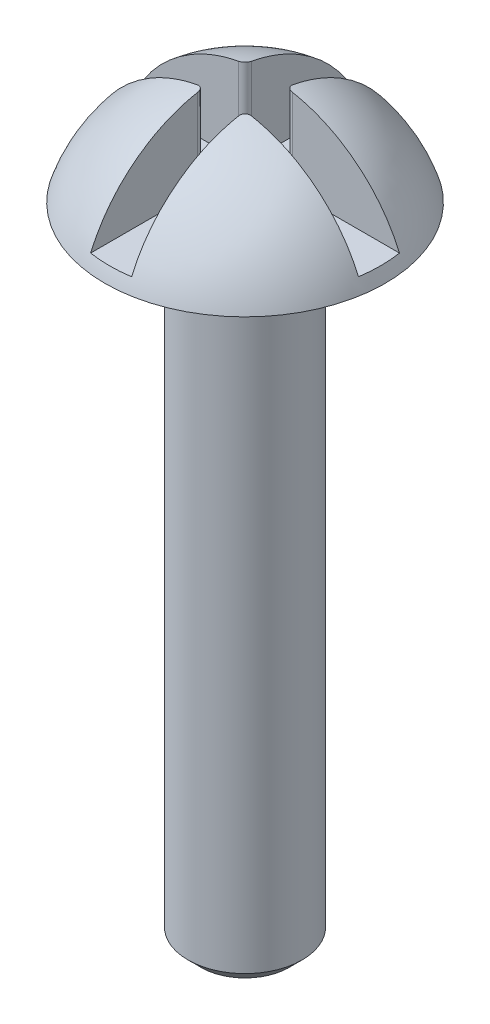
ISO-10303-21;
HEADER;
FILE_DESCRIPTION(('STEP AP214'),'2;1');
FILE_NAME('part.step','',(''),(''),'','','');
FILE_SCHEMA(('AUTOMOTIVE_DESIGN { 1 0 10303 214 1 1 1 1 }'));
ENDSEC;
DATA;
#1=APPLICATION_CONTEXT('core data for automotive mechanical design processes');
#2=APPLICATION_PROTOCOL_DEFINITION('international standard','automotive_design',2000,#1);
#3=PRODUCT_CONTEXT('',#1,'mechanical');
#4=PRODUCT('Part','Part','',(#3));
#5=PRODUCT_RELATED_PRODUCT_CATEGORY('part','',(#4));
#6=PRODUCT_DEFINITION_FORMATION('','',#4);
#7=PRODUCT_DEFINITION_CONTEXT('part definition',#1,'design');
#8=PRODUCT_DEFINITION('design','',#6,#7);
#9=PRODUCT_DEFINITION_SHAPE('','',#8);
#10=(LENGTH_UNIT() NAMED_UNIT(*) SI_UNIT(.MILLI.,.METRE.));
#11=(NAMED_UNIT(*) PLANE_ANGLE_UNIT() SI_UNIT($,.RADIAN.));
#12=(NAMED_UNIT(*) SI_UNIT($,.STERADIAN.) SOLID_ANGLE_UNIT());
#13=UNCERTAINTY_MEASURE_WITH_UNIT(LENGTH_MEASURE(1.E-05),#10,'distance_accuracy_value','');
#14=(GEOMETRIC_REPRESENTATION_CONTEXT(3) GLOBAL_UNCERTAINTY_ASSIGNED_CONTEXT((#13)) GLOBAL_UNIT_ASSIGNED_CONTEXT((#10,
#11,#12)) REPRESENTATION_CONTEXT('',''));
#15=CARTESIAN_POINT('',(0.,0.,0.));
#16=DIRECTION('',(0.,0.,1.));
#17=DIRECTION('',(1.,0.,0.));
#18=AXIS2_PLACEMENT_3D('',#15,#16,#17);
#19=CARTESIAN_POINT('',(0.,-0.8874521875,0.));
#20=DIRECTION('',(0.,1.,0.));
#21=DIRECTION('',(0.,0.,-1.));
#22=AXIS2_PLACEMENT_3D('',#19,#20,#21);
#23=SPHERICAL_SURFACE('',#22,2.9194521875);
#24=CARTESIAN_POINT('',(0.,0.,0.));
#25=DIRECTION('',(0.,1.,0.));
#26=DIRECTION('',(0.,0.,1.));
#27=AXIS2_PLACEMENT_3D('',#24,#25,#26);
#28=CIRCLE('',#27,2.7813);
#29=CARTESIAN_POINT('',(0.,0.,2.7813));
#30=VERTEX_POINT('',#29);
#31=EDGE_CURVE('E141',#30,#30,#28,.T.);
#32=ORIENTED_EDGE('',*,*,#31,.T.);
#33=EDGE_LOOP('',(#32));
#34=FACE_BOUND('',#33,.T.);
#35=CARTESIAN_POINT('',(0.,-0.8874521875,0.4064));
#36=DIRECTION('',(0.,0.,-1.));
#37=DIRECTION('',(-1.,0.,0.));
#38=AXIS2_PLACEMENT_3D('',#35,#36,#37);
#39=CIRCLE('',#38,2.89102751891063);
#40=CARTESIAN_POINT('',(0.5334,1.95394263812676,0.4064));
#41=VERTEX_POINT('',#40);
#42=CARTESIAN_POINT('',(2.65614890748806,0.254,0.4064));
#43=VERTEX_POINT('',#42);
#44=EDGE_CURVE('E130',#41,#43,#39,.T.);
#45=ORIENTED_EDGE('',*,*,#44,.F.);
#46=CARTESIAN_POINT('',(0.5334,1.95394263812676,0.4064));
#47=CARTESIAN_POINT('',(0.526429818175139,1.95525229722327,0.406393656141367));
#48=CARTESIAN_POINT('',(0.519437835446964,1.95645509605652,0.406973594128656));
#49=CARTESIAN_POINT('',(0.505606235655716,1.95861553609979,0.4092821138562));
#50=CARTESIAN_POINT('',(0.498766646008504,1.95957313351748,0.411010900579816));
#51=CARTESIAN_POINT('',(0.485430256638656,1.96121224794666,0.41559599247346));
#52=CARTESIAN_POINT('',(0.478933887553856,1.96189342496913,0.418453677685523));
#53=CARTESIAN_POINT('',(0.466492205552098,1.96295524916309,0.425222198161783));
#54=CARTESIAN_POINT('',(0.460546593915372,1.96333606009944,0.429132457981764));
#55=CARTESIAN_POINT('',(0.449486927445761,1.96378044826487,0.437816878775803));
#56=CARTESIAN_POINT('',(0.444359620352882,1.96384971613864,0.442573878351436));
#57=CARTESIAN_POINT('',(0.434956144691681,1.96368421809729,0.45286200159492));
#58=CARTESIAN_POINT('',(0.430680051299517,1.96344942534235,0.458393193563276));
#59=CARTESIAN_POINT('',(0.423132521628344,1.96268707574739,0.470014757316168));
#60=CARTESIAN_POINT('',(0.419852633333455,1.96216209494732,0.47609982079818));
#61=CARTESIAN_POINT('',(0.414329348110143,1.9608378635328,0.488695976120198));
#62=CARTESIAN_POINT('',(0.412085879160701,1.96003863198283,0.495207038321548));
#63=CARTESIAN_POINT('',(0.409056788031691,1.95839420105987,0.507011870443117));
#64=CARTESIAN_POINT('',(0.4080593321899,1.95759753777458,0.51225938370448));
#65=CARTESIAN_POINT('',(0.406730640863846,1.95586838945596,0.522808202103091));
#66=CARTESIAN_POINT('',(0.406398441009912,1.9549361031323,0.528109418162684));
#67=CARTESIAN_POINT('',(0.406399999999747,1.95394263812875,0.533400000000212));
#68=B_SPLINE_CURVE_WITH_KNOTS('',3,(#46,#47,#48,#49,#50,#51,#52,#53,#54,#55,#56,#57,#58,#59,#60,
#61,#62,#63,#64,#65,#66,#67),.UNSPECIFIED.,.F.,.F.,(4,2,2,2,2,2,2,2,2,2,4),(0.,
0.0212545383082465,0.0425128699765531,0.0637972700923001,0.0850700575426839,0.105952655327571,
0.126837096571577,0.147539053766297,0.168239572160783,0.184399511119075,0.200536007268686),.UNSPECIFIED.);
#69=CARTESIAN_POINT('',(0.4064,1.95394263812676,0.533399999999999));
#70=VERTEX_POINT('',#69);
#71=EDGE_CURVE('E199',#41,#70,#68,.T.);
#72=ORIENTED_EDGE('',*,*,#71,.T.);
#73=CARTESIAN_POINT('',(0.4064,-0.8874521875,0.));
#74=DIRECTION('',(-1.,0.,0.));
#75=DIRECTION('',(0.,0.,1.));
#76=AXIS2_PLACEMENT_3D('',#73,#74,#75);
#77=CIRCLE('',#76,2.89102751891063);
#78=CARTESIAN_POINT('',(0.4064,0.254,2.65614890748806));
#79=VERTEX_POINT('',#78);
#80=EDGE_CURVE('E157',#79,#70,#77,.T.);
#81=ORIENTED_EDGE('',*,*,#80,.F.);
#82=CARTESIAN_POINT('',(0.,0.254,0.));
#83=DIRECTION('',(0.,-1.,0.));
#84=DIRECTION('',(0.,0.,-1.));
#85=AXIS2_PLACEMENT_3D('',#82,#83,#84);
#86=CIRCLE('',#85,2.68705935527111);
#87=CARTESIAN_POINT('',(-0.4064,0.254,2.65614890748806));
#88=VERTEX_POINT('',#87);
#89=EDGE_CURVE('E133',#79,#88,#86,.T.);
#90=ORIENTED_EDGE('',*,*,#89,.T.);
#91=CARTESIAN_POINT('',(-0.4064,-0.8874521875,0.));
#92=DIRECTION('',(1.,0.,0.));
#93=DIRECTION('',(0.,0.,-1.));
#94=AXIS2_PLACEMENT_3D('',#91,#92,#93);
#95=CIRCLE('',#94,2.89102751891063);
#96=CARTESIAN_POINT('',(-0.4064,1.95394263812676,0.5334));
#97=VERTEX_POINT('',#96);
#98=EDGE_CURVE('E163',#97,#88,#95,.T.);
#99=ORIENTED_EDGE('',*,*,#98,.F.);
#100=CARTESIAN_POINT('',(-0.4064,1.95394263812676,0.5334));
#101=CARTESIAN_POINT('',(-0.406393656141367,1.95525229722327,0.526429818175139));
#102=CARTESIAN_POINT('',(-0.406973594128656,1.95645509605652,0.519437835446964));
#103=CARTESIAN_POINT('',(-0.4092821138562,1.95861553609979,0.505606235655716));
#104=CARTESIAN_POINT('',(-0.411010900579817,1.95957313351748,0.498766646008504));
#105=CARTESIAN_POINT('',(-0.41559599247346,1.96121224794666,0.485430256638656));
#106=CARTESIAN_POINT('',(-0.418453677685524,1.96189342496913,0.478933887553856));
#107=CARTESIAN_POINT('',(-0.425222198161783,1.96295524916309,0.466492205552098));
#108=CARTESIAN_POINT('',(-0.429132457981765,1.96333606009944,0.460546593915372));
#109=CARTESIAN_POINT('',(-0.437816878775803,1.96378044826487,0.449486927445761));
#110=CARTESIAN_POINT('',(-0.442573878351437,1.96384971613864,0.444359620352882));
#111=CARTESIAN_POINT('',(-0.452862001594921,1.96368421809729,0.434956144691681));
#112=CARTESIAN_POINT('',(-0.458393193563277,1.96344942534234,0.430680051299517));
#113=CARTESIAN_POINT('',(-0.470014757316169,1.96268707574739,0.423132521628344));
#114=CARTESIAN_POINT('',(-0.47609982079818,1.96216209494732,0.419852633333455));
#115=CARTESIAN_POINT('',(-0.488695976120198,1.9608378635328,0.414329348110143));
#116=CARTESIAN_POINT('',(-0.495207038321549,1.96003863198283,0.4120858791607));
#117=CARTESIAN_POINT('',(-0.507011870443117,1.95839420105987,0.409056788031691));
#118=CARTESIAN_POINT('',(-0.51225938370448,1.95759753777458,0.4080593321899));
#119=CARTESIAN_POINT('',(-0.522808202103091,1.95586838945596,0.406730640863846));
#120=CARTESIAN_POINT('',(-0.528109418162684,1.9549361031323,0.406398441009912));
#121=CARTESIAN_POINT('',(-0.533400000000212,1.95394263812875,0.406399999999747));
#122=B_SPLINE_CURVE_WITH_KNOTS('',3,(#100,#101,#102,#103,#104,#105,#106,#107,#108,#109,#110,
#111,#112,#113,#114,#115,#116,#117,#118,#119,#120,#121),.UNSPECIFIED.,.F.,.F.,(4,2,2,2,2,2,2,2,
2,2,4),(0.,0.0212545383082466,0.0425128699765532,0.0637972700923003,0.0850700575426841,
0.105952655327572,0.126837096571577,0.147539053766297,0.168239572160783,0.184399511119075,
0.200536007268686),.UNSPECIFIED.);
#123=CARTESIAN_POINT('',(-0.5334,1.95394263812676,0.4064));
#124=VERTEX_POINT('',#123);
#125=EDGE_CURVE('E177',#97,#124,#122,.T.);
#126=ORIENTED_EDGE('',*,*,#125,.T.);
#127=CARTESIAN_POINT('',(0.,-0.8874521875,0.4064));
#128=DIRECTION('',(0.,0.,-1.));
#129=DIRECTION('',(-1.,0.,0.));
#130=AXIS2_PLACEMENT_3D('',#127,#128,#129);
#131=CIRCLE('',#130,2.89102751891063);
#132=CARTESIAN_POINT('',(-2.65614890748806,0.254,0.4064));
#133=VERTEX_POINT('',#132);
#134=EDGE_CURVE('E160',#133,#124,#131,.T.);
#135=ORIENTED_EDGE('',*,*,#134,.F.);
#136=CARTESIAN_POINT('',(-2.65614890748806,0.254,-0.4064));
#137=VERTEX_POINT('',#136);
#138=EDGE_CURVE('E131',#133,#137,#86,.T.);
#139=ORIENTED_EDGE('',*,*,#138,.T.);
#140=CARTESIAN_POINT('',(0.,-0.8874521875,-0.406399999999999));
#141=DIRECTION('',(0.,0.,1.));
#142=DIRECTION('',(1.,0.,0.));
#143=AXIS2_PLACEMENT_3D('',#140,#141,#142);
#144=CIRCLE('',#143,2.89102751891063);
#145=CARTESIAN_POINT('',(-0.5334,1.95394263812676,-0.406399999999999));
#146=VERTEX_POINT('',#145);
#147=EDGE_CURVE('E146',#146,#137,#144,.T.);
#148=ORIENTED_EDGE('',*,*,#147,.F.);
#149=CARTESIAN_POINT('',(-0.5334,1.95394263812676,-0.406399999999999));
#150=CARTESIAN_POINT('',(-0.526429818175138,1.95525229722327,-0.406393656141367));
#151=CARTESIAN_POINT('',(-0.519437835446964,1.95645509605652,-0.406973594128656));
#152=CARTESIAN_POINT('',(-0.505606235655716,1.95861553609979,-0.4092821138562));
#153=CARTESIAN_POINT('',(-0.498766646008504,1.95957313351748,-0.411010900579816));
#154=CARTESIAN_POINT('',(-0.485430256638656,1.96121224794666,-0.41559599247346));
#155=CARTESIAN_POINT('',(-0.478933887553856,1.96189342496913,-0.418453677685523));
#156=CARTESIAN_POINT('',(-0.466492205552098,1.96295524916309,-0.425222198161783));
#157=CARTESIAN_POINT('',(-0.460546593915372,1.96333606009944,-0.429132457981764));
#158=CARTESIAN_POINT('',(-0.449486927445761,1.96378044826487,-0.437816878775803));
#159=CARTESIAN_POINT('',(-0.444359620352882,1.96384971613864,-0.442573878351436));
#160=CARTESIAN_POINT('',(-0.434956144691681,1.96368421809729,-0.45286200159492));
#161=CARTESIAN_POINT('',(-0.430680051299517,1.96344942534235,-0.458393193563276));
#162=CARTESIAN_POINT('',(-0.423132521628344,1.96268707574739,-0.470014757316168));
#163=CARTESIAN_POINT('',(-0.419852633333455,1.96216209494732,-0.47609982079818));
#164=CARTESIAN_POINT('',(-0.414329348110143,1.9608378635328,-0.488695976120198));
#165=CARTESIAN_POINT('',(-0.412085879160701,1.96003863198283,-0.495207038321548));
#166=CARTESIAN_POINT('',(-0.409056788031691,1.95839420105987,-0.507011870443117));
#167=CARTESIAN_POINT('',(-0.4080593321899,1.95759753777458,-0.51225938370448));
#168=CARTESIAN_POINT('',(-0.406730640863846,1.95586838945596,-0.522808202103091));
#169=CARTESIAN_POINT('',(-0.406398441009912,1.9549361031323,-0.528109418162684));
#170=CARTESIAN_POINT('',(-0.406399999999747,1.95394263812875,-0.533400000000212));
#171=B_SPLINE_CURVE_WITH_KNOTS('',3,(#149,#150,#151,#152,#153,#154,#155,#156,#157,#158,#159,
#160,#161,#162,#163,#164,#165,#166,#167,#168,#169,#170),.UNSPECIFIED.,.F.,.F.,(4,2,2,2,2,2,2,2,
2,2,4),(0.,0.0212545383082464,0.0425128699765531,0.0637972700923001,0.0850700575426839,
0.105952655327571,0.126837096571576,0.147539053766297,0.168239572160783,0.184399511119075,
0.200536007268686),.UNSPECIFIED.);
#172=CARTESIAN_POINT('',(-0.4064,1.95394263812676,-0.533399999999999));
#173=VERTEX_POINT('',#172);
#174=EDGE_CURVE('E171',#146,#173,#171,.T.);
#175=ORIENTED_EDGE('',*,*,#174,.T.);
#176=CARTESIAN_POINT('',(-0.4064,-0.8874521875,0.));
#177=DIRECTION('',(1.,0.,0.));
#178=DIRECTION('',(0.,0.,-1.));
#179=AXIS2_PLACEMENT_3D('',#176,#177,#178);
#180=CIRCLE('',#179,2.89102751891063);
#181=CARTESIAN_POINT('',(-0.4064,0.254,-2.65614890748806));
#182=VERTEX_POINT('',#181);
#183=EDGE_CURVE('E152',#182,#173,#180,.T.);
#184=ORIENTED_EDGE('',*,*,#183,.F.);
#185=CARTESIAN_POINT('',(0.4064,0.254,-2.65614890748806));
#186=VERTEX_POINT('',#185);
#187=EDGE_CURVE('E255',#182,#186,#86,.T.);
#188=ORIENTED_EDGE('',*,*,#187,.T.);
#189=CARTESIAN_POINT('',(0.4064,-0.8874521875,0.));
#190=DIRECTION('',(-1.,0.,0.));
#191=DIRECTION('',(0.,0.,1.));
#192=AXIS2_PLACEMENT_3D('',#189,#190,#191);
#193=CIRCLE('',#192,2.89102751891063);
#194=CARTESIAN_POINT('',(0.4064,1.95394263812676,-0.5334));
#195=VERTEX_POINT('',#194);
#196=EDGE_CURVE('E147',#195,#186,#193,.T.);
#197=ORIENTED_EDGE('',*,*,#196,.F.);
#198=CARTESIAN_POINT('',(0.4064,1.95394263812676,-0.5334));
#199=CARTESIAN_POINT('',(0.406393656141368,1.95525229722327,-0.526429818175138));
#200=CARTESIAN_POINT('',(0.406973594128657,1.95645509605652,-0.519437835446964));
#201=CARTESIAN_POINT('',(0.409282113856201,1.95861553609979,-0.505606235655716));
#202=CARTESIAN_POINT('',(0.411010900579817,1.95957313351748,-0.498766646008504));
#203=CARTESIAN_POINT('',(0.41559599247346,1.96121224794666,-0.485430256638656));
#204=CARTESIAN_POINT('',(0.418453677685524,1.96189342496913,-0.478933887553856));
#205=CARTESIAN_POINT('',(0.425222198161783,1.96295524916309,-0.466492205552098));
#206=CARTESIAN_POINT('',(0.429132457981765,1.96333606009944,-0.460546593915372));
#207=CARTESIAN_POINT('',(0.437816878775804,1.96378044826487,-0.449486927445761));
#208=CARTESIAN_POINT('',(0.442573878351437,1.96384971613864,-0.444359620352882));
#209=CARTESIAN_POINT('',(0.452862001594921,1.96368421809729,-0.434956144691681));
#210=CARTESIAN_POINT('',(0.458393193563277,1.96344942534234,-0.430680051299517));
#211=CARTESIAN_POINT('',(0.470014757316169,1.96268707574739,-0.423132521628343));
#212=CARTESIAN_POINT('',(0.47609982079818,1.96216209494732,-0.419852633333455));
#213=CARTESIAN_POINT('',(0.488695976120199,1.9608378635328,-0.414329348110143));
#214=CARTESIAN_POINT('',(0.495207038321549,1.96003863198283,-0.4120858791607));
#215=CARTESIAN_POINT('',(0.507011870443118,1.95839420105987,-0.409056788031691));
#216=CARTESIAN_POINT('',(0.512259383704481,1.95759753777458,-0.4080593321899));
#217=CARTESIAN_POINT('',(0.522808202103091,1.95586838945596,-0.406730640863846));
#218=CARTESIAN_POINT('',(0.528109418162684,1.9549361031323,-0.406398441009912));
#219=CARTESIAN_POINT('',(0.533400000000213,1.95394263812875,-0.406399999999747));
#220=B_SPLINE_CURVE_WITH_KNOTS('',3,(#198,#199,#200,#201,#202,#203,#204,#205,#206,#207,#208,
#209,#210,#211,#212,#213,#214,#215,#216,#217,#218,#219),.UNSPECIFIED.,.F.,.F.,(4,2,2,2,2,2,2,2,
2,2,4),(0.,0.0212545383082464,0.0425128699765531,0.0637972700923001,0.085070057542684,
0.105952655327572,0.126837096571577,0.147539053766297,0.168239572160783,0.184399511119075,
0.200536007268686),.UNSPECIFIED.);
#221=CARTESIAN_POINT('',(0.5334,1.95394263812676,-0.4064));
#222=VERTEX_POINT('',#221);
#223=EDGE_CURVE('E145',#195,#222,#220,.T.);
#224=ORIENTED_EDGE('',*,*,#223,.T.);
#225=CARTESIAN_POINT('',(0.,-0.8874521875,-0.4064));
#226=DIRECTION('',(0.,0.,1.));
#227=DIRECTION('',(1.,0.,0.));
#228=AXIS2_PLACEMENT_3D('',#225,#226,#227);
#229=CIRCLE('',#228,2.89102751891063);
#230=CARTESIAN_POINT('',(2.65614890748806,0.254,-0.4064));
#231=VERTEX_POINT('',#230);
#232=EDGE_CURVE('E138',#231,#222,#229,.T.);
#233=ORIENTED_EDGE('',*,*,#232,.F.);
#234=EDGE_CURVE('E120',#231,#43,#86,.T.);
#235=ORIENTED_EDGE('',*,*,#234,.T.);
#236=EDGE_LOOP('',(#45,#72,#81,#90,#99,#126,#135,#139,#148,#175,#184,#188,#197,#224,#233,#235));
#237=FACE_BOUND('',#236,.T.);
#238=ADVANCED_FACE('F33',(#34,#237),#23,.T.);
#239=CARTESIAN_POINT('',(0.,0.,0.));
#240=DIRECTION('',(0.,1.,0.));
#241=DIRECTION('',(0.,0.,1.));
#242=AXIS2_PLACEMENT_3D('',#239,#240,#241);
#243=PLANE('',#242);
#244=ORIENTED_EDGE('',*,*,#31,.F.);
#245=EDGE_LOOP('',(#244));
#246=FACE_BOUND('',#245,.T.);
#247=CARTESIAN_POINT('',(0.,0.,0.));
#248=DIRECTION('',(0.,1.,0.));
#249=DIRECTION('',(0.,0.,1.));
#250=AXIS2_PLACEMENT_3D('',#247,#248,#249);
#251=CIRCLE('',#250,1.1303);
#252=CARTESIAN_POINT('',(0.,0.,1.1303));
#253=VERTEX_POINT('',#252);
#254=EDGE_CURVE('E247',#253,#253,#251,.F.);
#255=ORIENTED_EDGE('',*,*,#254,.F.);
#256=EDGE_LOOP('',(#255));
#257=FACE_BOUND('',#256,.T.);
#258=ADVANCED_FACE('F186',(#246,#257),#243,.F.);
#259=CARTESIAN_POINT('',(0.,-12.7,0.));
#260=DIRECTION('',(0.,1.,0.));
#261=DIRECTION('',(0.,0.,1.));
#262=AXIS2_PLACEMENT_3D('',#259,#260,#261);
#263=CYLINDRICAL_SURFACE('',#262,1.1303);
#264=CARTESIAN_POINT('',(0.,-12.446,0.));
#265=DIRECTION('',(0.,-1.,0.));
#266=DIRECTION('',(0.,0.,-1.));
#267=AXIS2_PLACEMENT_3D('',#264,#265,#266);
#268=CIRCLE('',#267,1.1303);
#269=CARTESIAN_POINT('',(0.,-12.446,-1.1303));
#270=VERTEX_POINT('',#269);
#271=EDGE_CURVE('E253',#270,#270,#268,.F.);
#272=ORIENTED_EDGE('',*,*,#271,.T.);
#273=EDGE_LOOP('',(#272));
#274=FACE_BOUND('',#273,.T.);
#275=ORIENTED_EDGE('',*,*,#254,.T.);
#276=EDGE_LOOP('',(#275));
#277=FACE_BOUND('',#276,.T.);
#278=ADVANCED_FACE('F188',(#274,#277),#263,.T.);
#279=CARTESIAN_POINT('',(0.,-12.7,0.));
#280=DIRECTION('',(0.,-1.,0.));
#281=DIRECTION('',(0.,0.,-1.));
#282=AXIS2_PLACEMENT_3D('',#279,#280,#281);
#283=PLANE('',#282);
#284=CARTESIAN_POINT('',(0.,-12.7,0.));
#285=DIRECTION('',(0.,-1.,0.));
#286=DIRECTION('',(0.,0.,-1.));
#287=AXIS2_PLACEMENT_3D('',#284,#285,#286);
#288=CIRCLE('',#287,0.8763);
#289=CARTESIAN_POINT('',(0.,-12.7,-0.876300000000002));
#290=VERTEX_POINT('',#289);
#291=EDGE_CURVE('E250',#290,#290,#288,.T.);
#292=ORIENTED_EDGE('',*,*,#291,.T.);
#293=EDGE_LOOP('',(#292));
#294=FACE_BOUND('',#293,.T.);
#295=ADVANCED_FACE('F303',(#294),#283,.T.);
#296=CARTESIAN_POINT('',(0.,-12.7,0.));
#297=DIRECTION('',(0.,1.,0.));
#298=DIRECTION('',(0.,0.,1.));
#299=AXIS2_PLACEMENT_3D('',#296,#297,#298);
#300=CONICAL_SURFACE('',#299,0.8763,0.785398163397444);
#301=ORIENTED_EDGE('',*,*,#271,.F.);
#302=EDGE_LOOP('',(#301));
#303=FACE_BOUND('',#302,.T.);
#304=ORIENTED_EDGE('',*,*,#291,.F.);
#305=EDGE_LOOP('',(#304));
#306=FACE_BOUND('',#305,.T.);
#307=ADVANCED_FACE('F295',(#303,#306),#300,.T.);
#308=CARTESIAN_POINT('',(0.4064,2.032,-0.4064));
#309=DIRECTION('',(-1.,0.,0.));
#310=DIRECTION('',(0.,0.,1.));
#311=AXIS2_PLACEMENT_3D('',#308,#309,#310);
#312=PLANE('',#311);
#313=DIRECTION('',(0.,0.,-1.));
#314=VECTOR('',#313,1.);
#315=CARTESIAN_POINT('',(0.4064,0.254,-0.4064));
#316=LINE('',#315,#314);
#317=CARTESIAN_POINT('',(0.4064,0.254,-0.5334));
#318=VERTEX_POINT('',#317);
#319=EDGE_CURVE('E292',#318,#186,#316,.T.);
#320=ORIENTED_EDGE('',*,*,#319,.F.);
#321=DIRECTION('',(0.,-1.,0.));
#322=VECTOR('',#321,1.);
#323=CARTESIAN_POINT('',(0.4064,2.032,-0.5334));
#324=LINE('',#323,#322);
#325=EDGE_CURVE('E286',#318,#195,#324,.F.);
#326=ORIENTED_EDGE('',*,*,#325,.T.);
#327=ORIENTED_EDGE('',*,*,#196,.T.);
#328=EDGE_LOOP('',(#320,#326,#327));
#329=FACE_BOUND('',#328,.T.);
#330=ADVANCED_FACE('F291',(#329),#312,.T.);
#331=CARTESIAN_POINT('',(-0.4064,2.032,-0.406399999999999));
#332=DIRECTION('',(1.,0.,0.));
#333=DIRECTION('',(0.,0.,-1.));
#334=AXIS2_PLACEMENT_3D('',#331,#332,#333);
#335=PLANE('',#334);
#336=ORIENTED_EDGE('',*,*,#183,.T.);
#337=DIRECTION('',(0.,-1.,0.));
#338=VECTOR('',#337,1.);
#339=CARTESIAN_POINT('',(-0.4064,2.032,-0.533399999999999));
#340=LINE('',#339,#338);
#341=CARTESIAN_POINT('',(-0.4064,0.254,-0.533399999999999));
#342=VERTEX_POINT('',#341);
#343=EDGE_CURVE('E262',#173,#342,#340,.T.);
#344=ORIENTED_EDGE('',*,*,#343,.T.);
#345=DIRECTION('',(0.,0.,1.));
#346=VECTOR('',#345,1.);
#347=CARTESIAN_POINT('',(-0.4064,0.254,-0.406399999999999));
#348=LINE('',#347,#346);
#349=EDGE_CURVE('E238',#182,#342,#348,.T.);
#350=ORIENTED_EDGE('',*,*,#349,.F.);
#351=EDGE_LOOP('',(#336,#344,#350));
#352=FACE_BOUND('',#351,.T.);
#353=ADVANCED_FACE('F261',(#352),#335,.T.);
#354=CARTESIAN_POINT('',(-0.4064,2.032,-0.406399999999999));
#355=DIRECTION('',(0.,0.,1.));
#356=DIRECTION('',(1.,0.,0.));
#357=AXIS2_PLACEMENT_3D('',#354,#355,#356);
#358=PLANE('',#357);
#359=DIRECTION('',(-1.,0.,0.));
#360=VECTOR('',#359,1.);
#361=CARTESIAN_POINT('',(-0.4064,0.254,-0.406399999999999));
#362=LINE('',#361,#360);
#363=CARTESIAN_POINT('',(-0.5334,0.254,-0.406399999999999));
#364=VERTEX_POINT('',#363);
#365=EDGE_CURVE('E234',#364,#137,#362,.T.);
#366=ORIENTED_EDGE('',*,*,#365,.F.);
#367=DIRECTION('',(0.,-1.,0.));
#368=VECTOR('',#367,1.);
#369=CARTESIAN_POINT('',(-0.5334,2.032,-0.406399999999999));
#370=LINE('',#369,#368);
#371=EDGE_CURVE('E264',#364,#146,#370,.F.);
#372=ORIENTED_EDGE('',*,*,#371,.T.);
#373=ORIENTED_EDGE('',*,*,#147,.T.);
#374=EDGE_LOOP('',(#366,#372,#373));
#375=FACE_BOUND('',#374,.T.);
#376=ADVANCED_FACE('F301',(#375),#358,.T.);
#377=CARTESIAN_POINT('',(-0.4064,2.032,0.4064));
#378=DIRECTION('',(0.,0.,-1.));
#379=DIRECTION('',(-1.,0.,0.));
#380=AXIS2_PLACEMENT_3D('',#377,#378,#379);
#381=PLANE('',#380);
#382=ORIENTED_EDGE('',*,*,#134,.T.);
#383=DIRECTION('',(0.,-1.,0.));
#384=VECTOR('',#383,1.);
#385=CARTESIAN_POINT('',(-0.5334,2.032,0.4064));
#386=LINE('',#385,#384);
#387=CARTESIAN_POINT('',(-0.5334,0.254,0.4064));
#388=VERTEX_POINT('',#387);
#389=EDGE_CURVE('E223',#124,#388,#386,.T.);
#390=ORIENTED_EDGE('',*,*,#389,.T.);
#391=DIRECTION('',(1.,0.,0.));
#392=VECTOR('',#391,1.);
#393=CARTESIAN_POINT('',(-0.4064,0.254,0.4064));
#394=LINE('',#393,#392);
#395=EDGE_CURVE('E232',#133,#388,#394,.T.);
#396=ORIENTED_EDGE('',*,*,#395,.F.);
#397=EDGE_LOOP('',(#382,#390,#396));
#398=FACE_BOUND('',#397,.T.);
#399=ADVANCED_FACE('F230',(#398),#381,.T.);
#400=CARTESIAN_POINT('',(-0.4064,2.032,2.7813));
#401=DIRECTION('',(1.,0.,0.));
#402=DIRECTION('',(0.,0.,-1.));
#403=AXIS2_PLACEMENT_3D('',#400,#401,#402);
#404=PLANE('',#403);
#405=DIRECTION('',(0.,0.,1.));
#406=VECTOR('',#405,1.);
#407=CARTESIAN_POINT('',(-0.4064,0.254,2.7813));
#408=LINE('',#407,#406);
#409=CARTESIAN_POINT('',(-0.4064,0.254,0.533400000000001));
#410=VERTEX_POINT('',#409);
#411=EDGE_CURVE('E233',#410,#88,#408,.T.);
#412=ORIENTED_EDGE('',*,*,#411,.F.);
#413=DIRECTION('',(0.,-1.,0.));
#414=VECTOR('',#413,1.);
#415=CARTESIAN_POINT('',(-0.4064,2.032,0.5334));
#416=LINE('',#415,#414);
#417=EDGE_CURVE('E221',#410,#97,#416,.F.);
#418=ORIENTED_EDGE('',*,*,#417,.T.);
#419=ORIENTED_EDGE('',*,*,#98,.T.);
#420=EDGE_LOOP('',(#412,#418,#419));
#421=FACE_BOUND('',#420,.T.);
#422=ADVANCED_FACE('F275',(#421),#404,.T.);
#423=CARTESIAN_POINT('',(0.4064,2.032,2.7813));
#424=DIRECTION('',(-1.,0.,0.));
#425=DIRECTION('',(0.,0.,1.));
#426=AXIS2_PLACEMENT_3D('',#423,#424,#425);
#427=PLANE('',#426);
#428=ORIENTED_EDGE('',*,*,#80,.T.);
#429=DIRECTION('',(0.,-1.,0.));
#430=VECTOR('',#429,1.);
#431=CARTESIAN_POINT('',(0.4064,2.032,0.533399999999999));
#432=LINE('',#431,#430);
#433=CARTESIAN_POINT('',(0.4064,0.254,0.533399999999999));
#434=VERTEX_POINT('',#433);
#435=EDGE_CURVE('E166',#70,#434,#432,.T.);
#436=ORIENTED_EDGE('',*,*,#435,.T.);
#437=DIRECTION('',(0.,0.,-1.));
#438=VECTOR('',#437,1.);
#439=CARTESIAN_POINT('',(0.4064,0.254,2.7813));
#440=LINE('',#439,#438);
#441=EDGE_CURVE('E236',#79,#434,#440,.T.);
#442=ORIENTED_EDGE('',*,*,#441,.F.);
#443=EDGE_LOOP('',(#428,#436,#442));
#444=FACE_BOUND('',#443,.T.);
#445=ADVANCED_FACE('F279',(#444),#427,.T.);
#446=CARTESIAN_POINT('',(2.7813,2.032,0.4064));
#447=DIRECTION('',(0.,0.,-1.));
#448=DIRECTION('',(-1.,0.,0.));
#449=AXIS2_PLACEMENT_3D('',#446,#447,#448);
#450=PLANE('',#449);
#451=DIRECTION('',(1.,0.,0.));
#452=VECTOR('',#451,1.);
#453=CARTESIAN_POINT('',(2.7813,0.254,0.4064));
#454=LINE('',#453,#452);
#455=CARTESIAN_POINT('',(0.5334,0.254,0.4064));
#456=VERTEX_POINT('',#455);
#457=EDGE_CURVE('E125',#456,#43,#454,.T.);
#458=ORIENTED_EDGE('',*,*,#457,.F.);
#459=DIRECTION('',(0.,-1.,0.));
#460=VECTOR('',#459,1.);
#461=CARTESIAN_POINT('',(0.5334,2.032,0.4064));
#462=LINE('',#461,#460);
#463=EDGE_CURVE('E169',#456,#41,#462,.F.);
#464=ORIENTED_EDGE('',*,*,#463,.T.);
#465=ORIENTED_EDGE('',*,*,#44,.T.);
#466=EDGE_LOOP('',(#458,#464,#465));
#467=FACE_BOUND('',#466,.T.);
#468=ADVANCED_FACE('F285',(#467),#450,.T.);
#469=CARTESIAN_POINT('',(2.7813,2.032,-0.4064));
#470=DIRECTION('',(0.,0.,1.));
#471=DIRECTION('',(1.,0.,0.));
#472=AXIS2_PLACEMENT_3D('',#469,#470,#471);
#473=PLANE('',#472);
#474=ORIENTED_EDGE('',*,*,#232,.T.);
#475=DIRECTION('',(0.,-1.,0.));
#476=VECTOR('',#475,1.);
#477=CARTESIAN_POINT('',(0.5334,2.032,-0.4064));
#478=LINE('',#477,#476);
#479=CARTESIAN_POINT('',(0.5334,0.254,-0.4064));
#480=VERTEX_POINT('',#479);
#481=EDGE_CURVE('E140',#222,#480,#478,.T.);
#482=ORIENTED_EDGE('',*,*,#481,.T.);
#483=DIRECTION('',(-1.,0.,0.));
#484=VECTOR('',#483,1.);
#485=CARTESIAN_POINT('',(2.7813,0.254,-0.4064));
#486=LINE('',#485,#484);
#487=EDGE_CURVE('E123',#231,#480,#486,.T.);
#488=ORIENTED_EDGE('',*,*,#487,.F.);
#489=EDGE_LOOP('',(#474,#482,#488));
#490=FACE_BOUND('',#489,.T.);
#491=ADVANCED_FACE('F137',(#490),#473,.T.);
#492=CARTESIAN_POINT('',(0.,0.254,0.));
#493=DIRECTION('',(0.,-1.,0.));
#494=DIRECTION('',(0.,0.,-1.));
#495=AXIS2_PLACEMENT_3D('',#492,#493,#494);
#496=PLANE('',#495);
#497=ORIENTED_EDGE('',*,*,#487,.T.);
#498=CARTESIAN_POINT('',(0.5334,0.254,-0.5334));
#499=DIRECTION('',(0.,-1.,0.));
#500=DIRECTION('',(0.,0.,-1.));
#501=AXIS2_PLACEMENT_3D('',#498,#499,#500);
#502=CIRCLE('',#501,0.127);
#503=EDGE_CURVE('E272',#480,#318,#502,.T.);
#504=ORIENTED_EDGE('',*,*,#503,.T.);
#505=ORIENTED_EDGE('',*,*,#319,.T.);
#506=ORIENTED_EDGE('',*,*,#187,.F.);
#507=ORIENTED_EDGE('',*,*,#349,.T.);
#508=CARTESIAN_POINT('',(-0.5334,0.254,-0.533399999999999));
#509=DIRECTION('',(0.,-1.,0.));
#510=DIRECTION('',(0.,0.,-1.));
#511=AXIS2_PLACEMENT_3D('',#508,#509,#510);
#512=CIRCLE('',#511,0.127);
#513=EDGE_CURVE('E11',#342,#364,#512,.T.);
#514=ORIENTED_EDGE('',*,*,#513,.T.);
#515=ORIENTED_EDGE('',*,*,#365,.T.);
#516=ORIENTED_EDGE('',*,*,#138,.F.);
#517=ORIENTED_EDGE('',*,*,#395,.T.);
#518=CARTESIAN_POINT('',(-0.5334,0.254,0.5334));
#519=DIRECTION('',(0.,-1.,0.));
#520=DIRECTION('',(0.,0.,-1.));
#521=AXIS2_PLACEMENT_3D('',#518,#519,#520);
#522=CIRCLE('',#521,0.127);
#523=EDGE_CURVE('E42',#388,#410,#522,.T.);
#524=ORIENTED_EDGE('',*,*,#523,.T.);
#525=ORIENTED_EDGE('',*,*,#411,.T.);
#526=ORIENTED_EDGE('',*,*,#89,.F.);
#527=ORIENTED_EDGE('',*,*,#441,.T.);
#528=CARTESIAN_POINT('',(0.5334,0.254,0.533399999999999));
#529=DIRECTION('',(0.,-1.,0.));
#530=DIRECTION('',(0.,0.,-1.));
#531=AXIS2_PLACEMENT_3D('',#528,#529,#530);
#532=CIRCLE('',#531,0.127);
#533=EDGE_CURVE('E266',#434,#456,#532,.T.);
#534=ORIENTED_EDGE('',*,*,#533,.T.);
#535=ORIENTED_EDGE('',*,*,#457,.T.);
#536=ORIENTED_EDGE('',*,*,#234,.F.);
#537=EDGE_LOOP('',(#497,#504,#505,#506,#507,#514,#515,#516,#517,#524,#525,#526,#527,#534,#535,#536));
#538=FACE_BOUND('',#537,.T.);
#539=ADVANCED_FACE('F122',(#538),#496,.F.);
#540=CARTESIAN_POINT('',(0.5334,2.032,0.533399999999999));
#541=DIRECTION('',(0.,-1.,0.));
#542=DIRECTION('',(0.,0.,-1.));
#543=AXIS2_PLACEMENT_3D('',#540,#541,#542);
#544=CYLINDRICAL_SURFACE('',#543,0.127);
#545=ORIENTED_EDGE('',*,*,#71,.F.);
#546=ORIENTED_EDGE('',*,*,#463,.F.);
#547=ORIENTED_EDGE('',*,*,#533,.F.);
#548=ORIENTED_EDGE('',*,*,#435,.F.);
#549=EDGE_LOOP('',(#545,#546,#547,#548));
#550=FACE_BOUND('',#549,.T.);
#551=ADVANCED_FACE('F209',(#550),#544,.T.);
#552=CARTESIAN_POINT('',(0.5334,2.032,-0.5334));
#553=DIRECTION('',(0.,-1.,0.));
#554=DIRECTION('',(0.,0.,-1.));
#555=AXIS2_PLACEMENT_3D('',#552,#553,#554);
#556=CYLINDRICAL_SURFACE('',#555,0.127);
#557=ORIENTED_EDGE('',*,*,#223,.F.);
#558=ORIENTED_EDGE('',*,*,#325,.F.);
#559=ORIENTED_EDGE('',*,*,#503,.F.);
#560=ORIENTED_EDGE('',*,*,#481,.F.);
#561=EDGE_LOOP('',(#557,#558,#559,#560));
#562=FACE_BOUND('',#561,.T.);
#563=ADVANCED_FACE('F205',(#562),#556,.T.);
#564=CARTESIAN_POINT('',(-0.5334,2.032,0.5334));
#565=DIRECTION('',(0.,-1.,0.));
#566=DIRECTION('',(0.,0.,-1.));
#567=AXIS2_PLACEMENT_3D('',#564,#565,#566);
#568=CYLINDRICAL_SURFACE('',#567,0.127);
#569=ORIENTED_EDGE('',*,*,#125,.F.);
#570=ORIENTED_EDGE('',*,*,#417,.F.);
#571=ORIENTED_EDGE('',*,*,#523,.F.);
#572=ORIENTED_EDGE('',*,*,#389,.F.);
#573=EDGE_LOOP('',(#569,#570,#571,#572));
#574=FACE_BOUND('',#573,.T.);
#575=ADVANCED_FACE('F208',(#574),#568,.T.);
#576=CARTESIAN_POINT('',(-0.5334,2.032,-0.533399999999999));
#577=DIRECTION('',(0.,-1.,0.));
#578=DIRECTION('',(0.,0.,-1.));
#579=AXIS2_PLACEMENT_3D('',#576,#577,#578);
#580=CYLINDRICAL_SURFACE('',#579,0.127);
#581=ORIENTED_EDGE('',*,*,#174,.F.);
#582=ORIENTED_EDGE('',*,*,#371,.F.);
#583=ORIENTED_EDGE('',*,*,#513,.F.);
#584=ORIENTED_EDGE('',*,*,#343,.F.);
#585=EDGE_LOOP('',(#581,#582,#583,#584));
#586=FACE_BOUND('',#585,.T.);
#587=ADVANCED_FACE('F35',(#586),#580,.T.);
#588=CLOSED_SHELL('',(#238,#258,#278,#295,#307,#330,#353,#376,#399,#422,#445,#468,#491,#539,
#551,#563,#575,#587));
#589=MANIFOLD_SOLID_BREP('B2',#588);
#590=ADVANCED_BREP_SHAPE_REPRESENTATION('',(#18,#589),#14);
#591=SHAPE_DEFINITION_REPRESENTATION(#9,#590);
ENDSEC;
END-ISO-10303-21;
